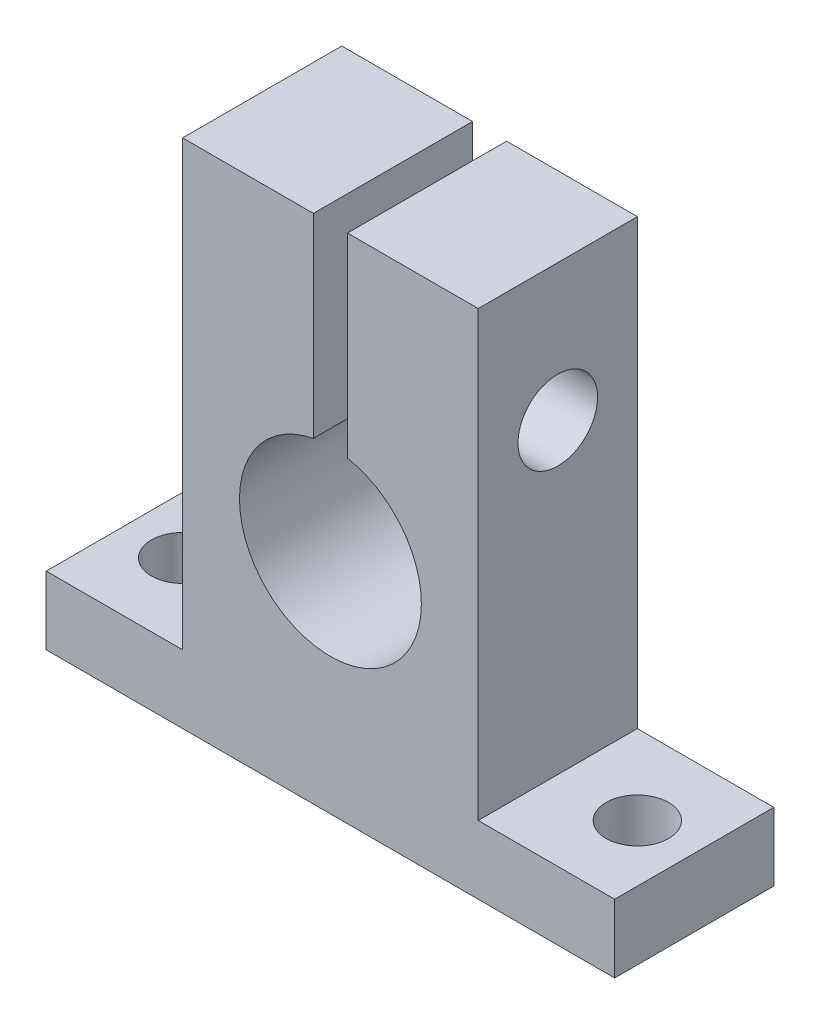
ISO-10303-21;
HEADER;
FILE_DESCRIPTION(('STEP AP214'),'2;1');
FILE_NAME('part.step','',(''),(''),'','','');
FILE_SCHEMA(('AUTOMOTIVE_DESIGN { 1 0 10303 214 1 1 1 1 }'));
ENDSEC;
DATA;
#1=APPLICATION_CONTEXT('core data for automotive mechanical design processes');
#2=APPLICATION_PROTOCOL_DEFINITION('international standard','automotive_design',2000,#1);
#3=PRODUCT_CONTEXT('',#1,'mechanical');
#4=PRODUCT('Part','Part','',(#3));
#5=PRODUCT_RELATED_PRODUCT_CATEGORY('part','',(#4));
#6=PRODUCT_DEFINITION_FORMATION('','',#4);
#7=PRODUCT_DEFINITION_CONTEXT('part definition',#1,'design');
#8=PRODUCT_DEFINITION('design','',#6,#7);
#9=PRODUCT_DEFINITION_SHAPE('','',#8);
#10=(LENGTH_UNIT() NAMED_UNIT(*) SI_UNIT(.MILLI.,.METRE.));
#11=(NAMED_UNIT(*) PLANE_ANGLE_UNIT() SI_UNIT($,.RADIAN.));
#12=(NAMED_UNIT(*) SI_UNIT($,.STERADIAN.) SOLID_ANGLE_UNIT());
#13=UNCERTAINTY_MEASURE_WITH_UNIT(LENGTH_MEASURE(1.E-05),#10,'distance_accuracy_value','');
#14=(GEOMETRIC_REPRESENTATION_CONTEXT(3) GLOBAL_UNCERTAINTY_ASSIGNED_CONTEXT((#13)) GLOBAL_UNIT_ASSIGNED_CONTEXT((#10,
#11,#12)) REPRESENTATION_CONTEXT('',''));
#15=CARTESIAN_POINT('',(0.,0.,0.));
#16=DIRECTION('',(0.,0.,1.));
#17=DIRECTION('',(1.,0.,0.));
#18=AXIS2_PLACEMENT_3D('',#15,#16,#17);
#19=CARTESIAN_POINT('',(5.82608695652173,-0.940493027310935,14.));
#20=DIRECTION('',(0.,0.,-1.));
#21=DIRECTION('',(-1.,0.,0.));
#22=AXIS2_PLACEMENT_3D('',#19,#20,#21);
#23=CYLINDRICAL_SURFACE('',#22,8.);
#24=CARTESIAN_POINT('',(5.82608695652173,-0.940493027310935,0.));
#25=DIRECTION('',(0.,0.,1.));
#26=DIRECTION('',(1.,0.,0.));
#27=AXIS2_PLACEMENT_3D('',#24,#25,#26);
#28=CIRCLE('',#27,8.);
#29=CARTESIAN_POINT('',(4.32608695652173,6.91762379543992,0.));
#30=VERTEX_POINT('',#29);
#31=CARTESIAN_POINT('',(7.32608695652173,6.91762379543992,0.));
#32=VERTEX_POINT('',#31);
#33=EDGE_CURVE('E171',#30,#32,#28,.T.);
#34=ORIENTED_EDGE('',*,*,#33,.F.);
#35=DIRECTION('',(0.,0.,-1.));
#36=VECTOR('',#35,1.);
#37=CARTESIAN_POINT('',(4.32608695652173,6.91762379543992,14.));
#38=LINE('',#37,#36);
#39=CARTESIAN_POINT('',(4.32608695652173,6.91762379543992,14.));
#40=VERTEX_POINT('',#39);
#41=EDGE_CURVE('E11',#40,#30,#38,.T.);
#42=ORIENTED_EDGE('',*,*,#41,.F.);
#43=CARTESIAN_POINT('',(5.82608695652173,-0.940493027310935,14.));
#44=DIRECTION('',(0.,0.,1.));
#45=DIRECTION('',(1.,0.,0.));
#46=AXIS2_PLACEMENT_3D('',#43,#44,#45);
#47=CIRCLE('',#46,8.);
#48=CARTESIAN_POINT('',(7.32608695652173,6.91762379543992,14.));
#49=VERTEX_POINT('',#48);
#50=EDGE_CURVE('E162',#40,#49,#47,.T.);
#51=ORIENTED_EDGE('',*,*,#50,.T.);
#52=DIRECTION('',(0.,0.,-1.));
#53=VECTOR('',#52,1.);
#54=CARTESIAN_POINT('',(7.32608695652173,6.91762379543992,14.));
#55=LINE('',#54,#53);
#56=EDGE_CURVE('E99',#49,#32,#55,.T.);
#57=ORIENTED_EDGE('',*,*,#56,.T.);
#58=EDGE_LOOP('',(#34,#42,#51,#57));
#59=FACE_BOUND('',#58,.T.);
#60=ADVANCED_FACE('F35',(#59),#23,.F.);
#61=CARTESIAN_POINT('',(4.32608695652173,0.,14.));
#62=DIRECTION('',(1.,0.,0.));
#63=DIRECTION('',(0.,1.,0.));
#64=AXIS2_PLACEMENT_3D('',#61,#62,#63);
#65=PLANE('',#64);
#66=CARTESIAN_POINT('',(4.32608695652173,12.0595069726891,7.));
#67=DIRECTION('',(1.,0.,0.));
#68=DIRECTION('',(0.,1.,0.));
#69=AXIS2_PLACEMENT_3D('',#66,#67,#68);
#70=CIRCLE('',#69,3.5);
#71=CARTESIAN_POINT('',(4.32608695652173,15.5595069726891,7.));
#72=VERTEX_POINT('',#71);
#73=EDGE_CURVE('E168',#72,#72,#70,.T.);
#74=ORIENTED_EDGE('',*,*,#73,.F.);
#75=EDGE_LOOP('',(#74));
#76=FACE_BOUND('',#75,.T.);
#77=DIRECTION('',(0.,-1.,0.));
#78=VECTOR('',#77,1.);
#79=CARTESIAN_POINT('',(4.32608695652173,0.,0.));
#80=LINE('',#79,#78);
#81=CARTESIAN_POINT('',(4.32608695652173,24.0595069726891,0.));
#82=VERTEX_POINT('',#81);
#83=EDGE_CURVE('E220',#82,#30,#80,.T.);
#84=ORIENTED_EDGE('',*,*,#83,.F.);
#85=DIRECTION('',(0.,0.,-1.));
#86=VECTOR('',#85,1.);
#87=CARTESIAN_POINT('',(4.32608695652173,24.0595069726891,14.));
#88=LINE('',#87,#86);
#89=CARTESIAN_POINT('',(4.32608695652173,24.0595069726891,14.));
#90=VERTEX_POINT('',#89);
#91=EDGE_CURVE('E44',#90,#82,#88,.T.);
#92=ORIENTED_EDGE('',*,*,#91,.F.);
#93=DIRECTION('',(0.,-1.,0.));
#94=VECTOR('',#93,1.);
#95=CARTESIAN_POINT('',(4.32608695652173,0.,14.));
#96=LINE('',#95,#94);
#97=EDGE_CURVE('E157',#90,#40,#96,.T.);
#98=ORIENTED_EDGE('',*,*,#97,.T.);
#99=ORIENTED_EDGE('',*,*,#41,.T.);
#100=EDGE_LOOP('',(#84,#92,#98,#99));
#101=FACE_BOUND('',#100,.T.);
#102=ADVANCED_FACE('F211',(#76,#101),#65,.T.);
#103=CARTESIAN_POINT('',(0.,24.0595069726891,14.));
#104=DIRECTION('',(0.,1.,0.));
#105=DIRECTION('',(0.,0.,1.));
#106=AXIS2_PLACEMENT_3D('',#103,#104,#105);
#107=PLANE('',#106);
#108=DIRECTION('',(1.,0.,0.));
#109=VECTOR('',#108,1.);
#110=CARTESIAN_POINT('',(0.,24.0595069726891,0.));
#111=LINE('',#110,#109);
#112=CARTESIAN_POINT('',(-7.17391304347828,24.0595069726891,0.));
#113=VERTEX_POINT('',#112);
#114=EDGE_CURVE('E227',#113,#82,#111,.T.);
#115=ORIENTED_EDGE('',*,*,#114,.F.);
#116=DIRECTION('',(0.,0.,-1.));
#117=VECTOR('',#116,1.);
#118=CARTESIAN_POINT('',(-7.17391304347828,24.0595069726891,14.));
#119=LINE('',#118,#117);
#120=CARTESIAN_POINT('',(-7.17391304347828,24.0595069726891,14.));
#121=VERTEX_POINT('',#120);
#122=EDGE_CURVE('E265',#121,#113,#119,.T.);
#123=ORIENTED_EDGE('',*,*,#122,.F.);
#124=DIRECTION('',(1.,0.,0.));
#125=VECTOR('',#124,1.);
#126=CARTESIAN_POINT('',(0.,24.0595069726891,14.));
#127=LINE('',#126,#125);
#128=EDGE_CURVE('E151',#121,#90,#127,.T.);
#129=ORIENTED_EDGE('',*,*,#128,.T.);
#130=ORIENTED_EDGE('',*,*,#91,.T.);
#131=EDGE_LOOP('',(#115,#123,#129,#130));
#132=FACE_BOUND('',#131,.T.);
#133=ADVANCED_FACE('F215',(#132),#107,.T.);
#134=CARTESIAN_POINT('',(-7.17391304347827,0.,14.));
#135=DIRECTION('',(1.,0.,0.));
#136=DIRECTION('',(0.,1.,0.));
#137=AXIS2_PLACEMENT_3D('',#134,#135,#136);
#138=PLANE('',#137);
#139=CARTESIAN_POINT('',(-7.17391304347828,12.0595069726891,7.));
#140=DIRECTION('',(1.,0.,0.));
#141=DIRECTION('',(0.,1.,0.));
#142=AXIS2_PLACEMENT_3D('',#139,#140,#141);
#143=CIRCLE('',#142,3.5);
#144=CARTESIAN_POINT('',(-7.17391304347828,15.5595069726891,7.));
#145=VERTEX_POINT('',#144);
#146=EDGE_CURVE('E176',#145,#145,#143,.T.);
#147=ORIENTED_EDGE('',*,*,#146,.T.);
#148=EDGE_LOOP('',(#147));
#149=FACE_BOUND('',#148,.T.);
#150=DIRECTION('',(0.,-1.,0.));
#151=VECTOR('',#150,1.);
#152=CARTESIAN_POINT('',(-7.17391304347827,0.,0.));
#153=LINE('',#152,#151);
#154=CARTESIAN_POINT('',(-7.17391304347827,-14.9404930273109,0.));
#155=VERTEX_POINT('',#154);
#156=EDGE_CURVE('E229',#113,#155,#153,.T.);
#157=ORIENTED_EDGE('',*,*,#156,.T.);
#158=DIRECTION('',(0.,0.,-1.));
#159=VECTOR('',#158,1.);
#160=CARTESIAN_POINT('',(-7.17391304347827,-14.9404930273109,14.));
#161=LINE('',#160,#159);
#162=CARTESIAN_POINT('',(-7.17391304347827,-14.9404930273109,14.));
#163=VERTEX_POINT('',#162);
#164=EDGE_CURVE('E263',#163,#155,#161,.T.);
#165=ORIENTED_EDGE('',*,*,#164,.F.);
#166=DIRECTION('',(0.,-1.,0.));
#167=VECTOR('',#166,1.);
#168=CARTESIAN_POINT('',(-7.17391304347827,0.,14.));
#169=LINE('',#168,#167);
#170=EDGE_CURVE('E156',#121,#163,#169,.T.);
#171=ORIENTED_EDGE('',*,*,#170,.F.);
#172=ORIENTED_EDGE('',*,*,#122,.T.);
#173=EDGE_LOOP('',(#157,#165,#171,#172));
#174=FACE_BOUND('',#173,.T.);
#175=ADVANCED_FACE('F305',(#149,#174),#138,.F.);
#176=CARTESIAN_POINT('',(0.,-14.9404930273109,14.));
#177=DIRECTION('',(0.,1.,0.));
#178=DIRECTION('',(0.,0.,1.));
#179=AXIS2_PLACEMENT_3D('',#176,#177,#178);
#180=PLANE('',#179);
#181=CARTESIAN_POINT('',(-14.1739130434783,-14.9404930273109,7.));
#182=DIRECTION('',(0.,1.,0.));
#183=DIRECTION('',(0.,0.,1.));
#184=AXIS2_PLACEMENT_3D('',#181,#182,#183);
#185=CIRCLE('',#184,2.75);
#186=CARTESIAN_POINT('',(-14.1739130434783,-14.9404930273109,9.75));
#187=VERTEX_POINT('',#186);
#188=EDGE_CURVE('E177',#187,#187,#185,.T.);
#189=ORIENTED_EDGE('',*,*,#188,.F.);
#190=EDGE_LOOP('',(#189));
#191=FACE_BOUND('',#190,.T.);
#192=DIRECTION('',(1.,0.,0.));
#193=VECTOR('',#192,1.);
#194=CARTESIAN_POINT('',(0.,-14.9404930273109,0.));
#195=LINE('',#194,#193);
#196=CARTESIAN_POINT('',(-19.1739130434783,-14.9404930273109,0.));
#197=VERTEX_POINT('',#196);
#198=EDGE_CURVE('E235',#197,#155,#195,.T.);
#199=ORIENTED_EDGE('',*,*,#198,.F.);
#200=DIRECTION('',(0.,0.,-1.));
#201=VECTOR('',#200,1.);
#202=CARTESIAN_POINT('',(-19.1739130434783,-14.9404930273109,14.));
#203=LINE('',#202,#201);
#204=CARTESIAN_POINT('',(-19.1739130434783,-14.9404930273109,14.));
#205=VERTEX_POINT('',#204);
#206=EDGE_CURVE('E261',#205,#197,#203,.T.);
#207=ORIENTED_EDGE('',*,*,#206,.F.);
#208=DIRECTION('',(1.,0.,0.));
#209=VECTOR('',#208,1.);
#210=CARTESIAN_POINT('',(0.,-14.9404930273109,14.));
#211=LINE('',#210,#209);
#212=EDGE_CURVE('E160',#205,#163,#211,.T.);
#213=ORIENTED_EDGE('',*,*,#212,.T.);
#214=ORIENTED_EDGE('',*,*,#164,.T.);
#215=EDGE_LOOP('',(#199,#207,#213,#214));
#216=FACE_BOUND('',#215,.T.);
#217=ADVANCED_FACE('F301',(#191,#216),#180,.T.);
#218=CARTESIAN_POINT('',(-19.1739130434783,0.,14.));
#219=DIRECTION('',(1.,0.,0.));
#220=DIRECTION('',(0.,1.,0.));
#221=AXIS2_PLACEMENT_3D('',#218,#219,#220);
#222=PLANE('',#221);
#223=DIRECTION('',(0.,-1.,0.));
#224=VECTOR('',#223,1.);
#225=CARTESIAN_POINT('',(-19.1739130434783,0.,0.));
#226=LINE('',#225,#224);
#227=CARTESIAN_POINT('',(-19.1739130434783,-20.9404930273109,0.));
#228=VERTEX_POINT('',#227);
#229=EDGE_CURVE('E238',#197,#228,#226,.T.);
#230=ORIENTED_EDGE('',*,*,#229,.T.);
#231=DIRECTION('',(0.,0.,-1.));
#232=VECTOR('',#231,1.);
#233=CARTESIAN_POINT('',(-19.1739130434783,-20.9404930273109,14.));
#234=LINE('',#233,#232);
#235=CARTESIAN_POINT('',(-19.1739130434783,-20.9404930273109,14.));
#236=VERTEX_POINT('',#235);
#237=EDGE_CURVE('E258',#236,#228,#234,.T.);
#238=ORIENTED_EDGE('',*,*,#237,.F.);
#239=DIRECTION('',(0.,-1.,0.));
#240=VECTOR('',#239,1.);
#241=CARTESIAN_POINT('',(-19.1739130434783,0.,14.));
#242=LINE('',#241,#240);
#243=EDGE_CURVE('E323',#205,#236,#242,.T.);
#244=ORIENTED_EDGE('',*,*,#243,.F.);
#245=ORIENTED_EDGE('',*,*,#206,.T.);
#246=EDGE_LOOP('',(#230,#238,#244,#245));
#247=FACE_BOUND('',#246,.T.);
#248=ADVANCED_FACE('F297',(#247),#222,.F.);
#249=CARTESIAN_POINT('',(0.,-20.9404930273109,14.));
#250=DIRECTION('',(0.,1.,0.));
#251=DIRECTION('',(-1.,0.,0.));
#252=AXIS2_PLACEMENT_3D('',#249,#250,#251);
#253=PLANE('',#252);
#254=CARTESIAN_POINT('',(-14.1739130434783,-20.9404930273109,7.));
#255=DIRECTION('',(0.,-1.,0.));
#256=DIRECTION('',(1.,0.,0.));
#257=AXIS2_PLACEMENT_3D('',#254,#255,#256);
#258=CIRCLE('',#257,2.75);
#259=CARTESIAN_POINT('',(-11.4239130434783,-20.9404930273109,7.));
#260=VERTEX_POINT('',#259);
#261=EDGE_CURVE('E185',#260,#260,#258,.T.);
#262=ORIENTED_EDGE('',*,*,#261,.F.);
#263=EDGE_LOOP('',(#262));
#264=FACE_BOUND('',#263,.T.);
#265=CARTESIAN_POINT('',(25.8260869565217,-20.9404930273109,7.));
#266=DIRECTION('',(0.,-1.,0.));
#267=DIRECTION('',(-1.,0.,0.));
#268=AXIS2_PLACEMENT_3D('',#265,#266,#267);
#269=CIRCLE('',#268,2.75);
#270=CARTESIAN_POINT('',(23.0760869565217,-20.9404930273109,7.));
#271=VERTEX_POINT('',#270);
#272=EDGE_CURVE('E182',#271,#271,#269,.T.);
#273=ORIENTED_EDGE('',*,*,#272,.F.);
#274=EDGE_LOOP('',(#273));
#275=FACE_BOUND('',#274,.T.);
#276=DIRECTION('',(1.,0.,0.));
#277=VECTOR('',#276,1.);
#278=CARTESIAN_POINT('',(0.,-20.9404930273109,0.));
#279=LINE('',#278,#277);
#280=CARTESIAN_POINT('',(30.8260869565217,-20.9404930273109,0.));
#281=VERTEX_POINT('',#280);
#282=EDGE_CURVE('E240',#228,#281,#279,.T.);
#283=ORIENTED_EDGE('',*,*,#282,.T.);
#284=DIRECTION('',(0.,0.,-1.));
#285=VECTOR('',#284,1.);
#286=CARTESIAN_POINT('',(30.8260869565217,-20.9404930273109,14.));
#287=LINE('',#286,#285);
#288=CARTESIAN_POINT('',(30.8260869565217,-20.9404930273109,14.));
#289=VERTEX_POINT('',#288);
#290=EDGE_CURVE('E256',#289,#281,#287,.T.);
#291=ORIENTED_EDGE('',*,*,#290,.F.);
#292=DIRECTION('',(1.,0.,0.));
#293=VECTOR('',#292,1.);
#294=CARTESIAN_POINT('',(0.,-20.9404930273109,14.));
#295=LINE('',#294,#293);
#296=EDGE_CURVE('E325',#236,#289,#295,.T.);
#297=ORIENTED_EDGE('',*,*,#296,.F.);
#298=ORIENTED_EDGE('',*,*,#237,.T.);
#299=EDGE_LOOP('',(#283,#291,#297,#298));
#300=FACE_BOUND('',#299,.T.);
#301=ADVANCED_FACE('F293',(#264,#275,#300),#253,.F.);
#302=CARTESIAN_POINT('',(30.8260869565217,0.,14.));
#303=DIRECTION('',(1.,0.,0.));
#304=DIRECTION('',(0.,1.,0.));
#305=AXIS2_PLACEMENT_3D('',#302,#303,#304);
#306=PLANE('',#305);
#307=DIRECTION('',(0.,-1.,0.));
#308=VECTOR('',#307,1.);
#309=CARTESIAN_POINT('',(30.8260869565217,0.,0.));
#310=LINE('',#309,#308);
#311=CARTESIAN_POINT('',(30.8260869565217,-14.9404930273109,0.));
#312=VERTEX_POINT('',#311);
#313=EDGE_CURVE('E243',#312,#281,#310,.T.);
#314=ORIENTED_EDGE('',*,*,#313,.F.);
#315=DIRECTION('',(0.,0.,-1.));
#316=VECTOR('',#315,1.);
#317=CARTESIAN_POINT('',(30.8260869565217,-14.9404930273109,14.));
#318=LINE('',#317,#316);
#319=CARTESIAN_POINT('',(30.8260869565217,-14.9404930273109,14.));
#320=VERTEX_POINT('',#319);
#321=EDGE_CURVE('E254',#320,#312,#318,.T.);
#322=ORIENTED_EDGE('',*,*,#321,.F.);
#323=DIRECTION('',(0.,-1.,0.));
#324=VECTOR('',#323,1.);
#325=CARTESIAN_POINT('',(30.8260869565217,0.,14.));
#326=LINE('',#325,#324);
#327=EDGE_CURVE('E329',#320,#289,#326,.T.);
#328=ORIENTED_EDGE('',*,*,#327,.T.);
#329=ORIENTED_EDGE('',*,*,#290,.T.);
#330=EDGE_LOOP('',(#314,#322,#328,#329));
#331=FACE_BOUND('',#330,.T.);
#332=ADVANCED_FACE('F290',(#331),#306,.T.);
#333=CARTESIAN_POINT('',(0.,-14.9404930273109,14.));
#334=DIRECTION('',(0.,-1.,0.));
#335=DIRECTION('',(0.,0.,-1.));
#336=AXIS2_PLACEMENT_3D('',#333,#334,#335);
#337=PLANE('',#336);
#338=CARTESIAN_POINT('',(25.8260869565217,-14.9404930273109,7.));
#339=DIRECTION('',(0.,-1.,0.));
#340=DIRECTION('',(0.,0.,-1.));
#341=AXIS2_PLACEMENT_3D('',#338,#339,#340);
#342=CIRCLE('',#341,2.75);
#343=CARTESIAN_POINT('',(25.8260869565217,-14.9404930273109,4.25));
#344=VERTEX_POINT('',#343);
#345=EDGE_CURVE('E38',#344,#344,#342,.T.);
#346=ORIENTED_EDGE('',*,*,#345,.T.);
#347=EDGE_LOOP('',(#346));
#348=FACE_BOUND('',#347,.T.);
#349=DIRECTION('',(-1.,0.,0.));
#350=VECTOR('',#349,1.);
#351=CARTESIAN_POINT('',(0.,-14.9404930273109,0.));
#352=LINE('',#351,#350);
#353=CARTESIAN_POINT('',(18.8260869565217,-14.9404930273109,0.));
#354=VERTEX_POINT('',#353);
#355=EDGE_CURVE('E246',#312,#354,#352,.T.);
#356=ORIENTED_EDGE('',*,*,#355,.T.);
#357=DIRECTION('',(0.,0.,-1.));
#358=VECTOR('',#357,1.);
#359=CARTESIAN_POINT('',(18.8260869565217,-14.9404930273109,14.));
#360=LINE('',#359,#358);
#361=CARTESIAN_POINT('',(18.8260869565217,-14.9404930273109,14.));
#362=VERTEX_POINT('',#361);
#363=EDGE_CURVE('E140',#362,#354,#360,.T.);
#364=ORIENTED_EDGE('',*,*,#363,.F.);
#365=DIRECTION('',(-1.,0.,0.));
#366=VECTOR('',#365,1.);
#367=CARTESIAN_POINT('',(0.,-14.9404930273109,14.));
#368=LINE('',#367,#366);
#369=EDGE_CURVE('E146',#320,#362,#368,.T.);
#370=ORIENTED_EDGE('',*,*,#369,.F.);
#371=ORIENTED_EDGE('',*,*,#321,.T.);
#372=EDGE_LOOP('',(#356,#364,#370,#371));
#373=FACE_BOUND('',#372,.T.);
#374=ADVANCED_FACE('F192',(#348,#373),#337,.F.);
#375=CARTESIAN_POINT('',(18.8260869565217,0.,14.));
#376=DIRECTION('',(1.,0.,0.));
#377=DIRECTION('',(0.,1.,0.));
#378=AXIS2_PLACEMENT_3D('',#375,#376,#377);
#379=PLANE('',#378);
#380=CARTESIAN_POINT('',(18.8260869565217,12.0595069726891,7.));
#381=DIRECTION('',(1.,0.,0.));
#382=DIRECTION('',(0.,1.,0.));
#383=AXIS2_PLACEMENT_3D('',#380,#381,#382);
#384=CIRCLE('',#383,3.5);
#385=CARTESIAN_POINT('',(18.8260869565217,15.5595069726891,7.));
#386=VERTEX_POINT('',#385);
#387=EDGE_CURVE('E173',#386,#386,#384,.T.);
#388=ORIENTED_EDGE('',*,*,#387,.F.);
#389=EDGE_LOOP('',(#388));
#390=FACE_BOUND('',#389,.T.);
#391=DIRECTION('',(0.,-1.,0.));
#392=VECTOR('',#391,1.);
#393=CARTESIAN_POINT('',(18.8260869565217,0.,0.));
#394=LINE('',#393,#392);
#395=CARTESIAN_POINT('',(18.8260869565217,24.0595069726891,0.));
#396=VERTEX_POINT('',#395);
#397=EDGE_CURVE('E135',#396,#354,#394,.T.);
#398=ORIENTED_EDGE('',*,*,#397,.F.);
#399=DIRECTION('',(0.,0.,-1.));
#400=VECTOR('',#399,1.);
#401=CARTESIAN_POINT('',(18.8260869565217,24.0595069726891,14.));
#402=LINE('',#401,#400);
#403=CARTESIAN_POINT('',(18.8260869565217,24.0595069726891,14.));
#404=VERTEX_POINT('',#403);
#405=EDGE_CURVE('E130',#404,#396,#402,.T.);
#406=ORIENTED_EDGE('',*,*,#405,.F.);
#407=DIRECTION('',(0.,-1.,0.));
#408=VECTOR('',#407,1.);
#409=CARTESIAN_POINT('',(18.8260869565217,0.,14.));
#410=LINE('',#409,#408);
#411=EDGE_CURVE('E133',#404,#362,#410,.T.);
#412=ORIENTED_EDGE('',*,*,#411,.T.);
#413=ORIENTED_EDGE('',*,*,#363,.T.);
#414=EDGE_LOOP('',(#398,#406,#412,#413));
#415=FACE_BOUND('',#414,.T.);
#416=ADVANCED_FACE('F132',(#390,#415),#379,.T.);
#417=CARTESIAN_POINT('',(7.32608695652173,24.0595069726891,0.));
#418=VERTEX_POINT('',#417);
#419=EDGE_CURVE('E231',#418,#396,#111,.T.);
#420=ORIENTED_EDGE('',*,*,#419,.F.);
#421=DIRECTION('',(0.,0.,-1.));
#422=VECTOR('',#421,1.);
#423=CARTESIAN_POINT('',(7.32608695652173,24.0595069726891,14.));
#424=LINE('',#423,#422);
#425=CARTESIAN_POINT('',(7.32608695652173,24.0595069726891,14.));
#426=VERTEX_POINT('',#425);
#427=EDGE_CURVE('E92',#426,#418,#424,.T.);
#428=ORIENTED_EDGE('',*,*,#427,.F.);
#429=EDGE_CURVE('E143',#426,#404,#127,.T.);
#430=ORIENTED_EDGE('',*,*,#429,.T.);
#431=ORIENTED_EDGE('',*,*,#405,.T.);
#432=EDGE_LOOP('',(#420,#428,#430,#431));
#433=FACE_BOUND('',#432,.T.);
#434=ADVANCED_FACE('F149',(#433),#107,.T.);
#435=CARTESIAN_POINT('',(7.32608695652173,0.,14.));
#436=DIRECTION('',(1.,0.,0.));
#437=DIRECTION('',(0.,1.,0.));
#438=AXIS2_PLACEMENT_3D('',#435,#436,#437);
#439=PLANE('',#438);
#440=CARTESIAN_POINT('',(7.32608695652173,12.0595069726891,7.));
#441=DIRECTION('',(1.,0.,0.));
#442=DIRECTION('',(0.,1.,0.));
#443=AXIS2_PLACEMENT_3D('',#440,#441,#442);
#444=CIRCLE('',#443,3.5);
#445=CARTESIAN_POINT('',(7.32608695652173,15.5595069726891,7.));
#446=VERTEX_POINT('',#445);
#447=EDGE_CURVE('E172',#446,#446,#444,.T.);
#448=ORIENTED_EDGE('',*,*,#447,.T.);
#449=EDGE_LOOP('',(#448));
#450=FACE_BOUND('',#449,.T.);
#451=DIRECTION('',(0.,-1.,0.));
#452=VECTOR('',#451,1.);
#453=CARTESIAN_POINT('',(7.32608695652173,0.,0.));
#454=LINE('',#453,#452);
#455=EDGE_CURVE('E165',#418,#32,#454,.T.);
#456=ORIENTED_EDGE('',*,*,#455,.T.);
#457=ORIENTED_EDGE('',*,*,#56,.F.);
#458=DIRECTION('',(0.,-1.,0.));
#459=VECTOR('',#458,1.);
#460=CARTESIAN_POINT('',(7.32608695652173,0.,14.));
#461=LINE('',#460,#459);
#462=EDGE_CURVE('E53',#426,#49,#461,.T.);
#463=ORIENTED_EDGE('',*,*,#462,.F.);
#464=ORIENTED_EDGE('',*,*,#427,.T.);
#465=EDGE_LOOP('',(#456,#457,#463,#464));
#466=FACE_BOUND('',#465,.T.);
#467=ADVANCED_FACE('F270',(#450,#466),#439,.F.);
#468=CARTESIAN_POINT('',(0.,0.,14.));
#469=DIRECTION('',(0.,0.,1.));
#470=DIRECTION('',(1.,0.,0.));
#471=AXIS2_PLACEMENT_3D('',#468,#469,#470);
#472=PLANE('',#471);
#473=ORIENTED_EDGE('',*,*,#50,.F.);
#474=ORIENTED_EDGE('',*,*,#97,.F.);
#475=ORIENTED_EDGE('',*,*,#128,.F.);
#476=ORIENTED_EDGE('',*,*,#170,.T.);
#477=ORIENTED_EDGE('',*,*,#212,.F.);
#478=ORIENTED_EDGE('',*,*,#243,.T.);
#479=ORIENTED_EDGE('',*,*,#296,.T.);
#480=ORIENTED_EDGE('',*,*,#327,.F.);
#481=ORIENTED_EDGE('',*,*,#369,.T.);
#482=ORIENTED_EDGE('',*,*,#411,.F.);
#483=ORIENTED_EDGE('',*,*,#429,.F.);
#484=ORIENTED_EDGE('',*,*,#462,.T.);
#485=EDGE_LOOP('',(#473,#474,#475,#476,#477,#478,#479,#480,#481,#482,#483,#484));
#486=FACE_BOUND('',#485,.T.);
#487=ADVANCED_FACE('F142',(#486),#472,.T.);
#488=CARTESIAN_POINT('',(0.,0.,0.));
#489=DIRECTION('',(0.,0.,1.));
#490=DIRECTION('',(1.,0.,0.));
#491=AXIS2_PLACEMENT_3D('',#488,#489,#490);
#492=PLANE('',#491);
#493=ORIENTED_EDGE('',*,*,#33,.T.);
#494=ORIENTED_EDGE('',*,*,#455,.F.);
#495=ORIENTED_EDGE('',*,*,#419,.T.);
#496=ORIENTED_EDGE('',*,*,#397,.T.);
#497=ORIENTED_EDGE('',*,*,#355,.F.);
#498=ORIENTED_EDGE('',*,*,#313,.T.);
#499=ORIENTED_EDGE('',*,*,#282,.F.);
#500=ORIENTED_EDGE('',*,*,#229,.F.);
#501=ORIENTED_EDGE('',*,*,#198,.T.);
#502=ORIENTED_EDGE('',*,*,#156,.F.);
#503=ORIENTED_EDGE('',*,*,#114,.T.);
#504=ORIENTED_EDGE('',*,*,#83,.T.);
#505=EDGE_LOOP('',(#493,#494,#495,#496,#497,#498,#499,#500,#501,#502,#503,#504));
#506=FACE_BOUND('',#505,.T.);
#507=ADVANCED_FACE('F224',(#506),#492,.F.);
#508=CARTESIAN_POINT('',(-7.17391304347828,12.0595069726891,7.));
#509=DIRECTION('',(1.,0.,0.));
#510=DIRECTION('',(0.,1.,0.));
#511=AXIS2_PLACEMENT_3D('',#508,#509,#510);
#512=CYLINDRICAL_SURFACE('',#511,3.5);
#513=CARTESIAN_POINT('',(18.8260869565217,15.5595069726891,7.));
#514=CARTESIAN_POINT('',(18.7062952898551,15.5595069726891,7.));
#515=CARTESIAN_POINT('',(18.5865036231884,15.5595069726891,7.));
#516=CARTESIAN_POINT('',(18.3469202898551,15.5595069726891,7.));
#517=CARTESIAN_POINT('',(18.2271286231884,15.5595069726891,7.));
#518=CARTESIAN_POINT('',(17.9875452898551,15.5595069726891,7.));
#519=CARTESIAN_POINT('',(17.8677536231884,15.5595069726891,7.));
#520=CARTESIAN_POINT('',(17.6281702898551,15.5595069726891,7.));
#521=CARTESIAN_POINT('',(17.5083786231884,15.5595069726891,7.));
#522=CARTESIAN_POINT('',(17.2687952898551,15.5595069726891,7.));
#523=CARTESIAN_POINT('',(17.1490036231884,15.5595069726891,7.));
#524=CARTESIAN_POINT('',(16.9094202898551,15.5595069726891,7.));
#525=CARTESIAN_POINT('',(16.7896286231884,15.5595069726891,7.));
#526=CARTESIAN_POINT('',(16.5500452898551,15.5595069726891,7.));
#527=CARTESIAN_POINT('',(16.4302536231884,15.5595069726891,7.));
#528=CARTESIAN_POINT('',(16.1906702898551,15.5595069726891,7.));
#529=CARTESIAN_POINT('',(16.0708786231884,15.5595069726891,7.));
#530=CARTESIAN_POINT('',(15.8312952898551,15.5595069726891,7.));
#531=CARTESIAN_POINT('',(15.7115036231884,15.5595069726891,7.));
#532=CARTESIAN_POINT('',(15.4719202898551,15.5595069726891,7.));
#533=CARTESIAN_POINT('',(15.3521286231884,15.5595069726891,7.));
#534=CARTESIAN_POINT('',(15.1125452898551,15.5595069726891,7.));
#535=CARTESIAN_POINT('',(14.9927536231884,15.5595069726891,7.));
#536=CARTESIAN_POINT('',(14.7531702898551,15.5595069726891,7.));
#537=CARTESIAN_POINT('',(14.6333786231884,15.5595069726891,7.));
#538=CARTESIAN_POINT('',(14.3937952898551,15.5595069726891,7.));
#539=CARTESIAN_POINT('',(14.2740036231884,15.5595069726891,7.));
#540=CARTESIAN_POINT('',(14.0344202898551,15.5595069726891,7.));
#541=CARTESIAN_POINT('',(13.9146286231884,15.5595069726891,7.));
#542=CARTESIAN_POINT('',(13.6750452898551,15.5595069726891,7.));
#543=CARTESIAN_POINT('',(13.5552536231884,15.5595069726891,7.));
#544=CARTESIAN_POINT('',(13.3156702898551,15.5595069726891,7.));
#545=CARTESIAN_POINT('',(13.1958786231884,15.5595069726891,7.));
#546=CARTESIAN_POINT('',(12.9562952898551,15.5595069726891,7.));
#547=CARTESIAN_POINT('',(12.8365036231884,15.5595069726891,7.));
#548=CARTESIAN_POINT('',(12.5969202898551,15.5595069726891,7.));
#549=CARTESIAN_POINT('',(12.4771286231884,15.5595069726891,7.));
#550=CARTESIAN_POINT('',(12.2375452898551,15.5595069726891,7.));
#551=CARTESIAN_POINT('',(12.1177536231884,15.5595069726891,7.));
#552=CARTESIAN_POINT('',(11.8781702898551,15.5595069726891,7.));
#553=CARTESIAN_POINT('',(11.7583786231884,15.5595069726891,7.));
#554=CARTESIAN_POINT('',(11.5187952898551,15.5595069726891,7.));
#555=CARTESIAN_POINT('',(11.3990036231884,15.5595069726891,7.));
#556=CARTESIAN_POINT('',(11.1594202898551,15.5595069726891,7.));
#557=CARTESIAN_POINT('',(11.0396286231884,15.5595069726891,7.));
#558=CARTESIAN_POINT('',(10.8000452898551,15.5595069726891,7.));
#559=CARTESIAN_POINT('',(10.6802536231884,15.5595069726891,7.));
#560=CARTESIAN_POINT('',(10.4406702898551,15.5595069726891,7.));
#561=CARTESIAN_POINT('',(10.3208786231884,15.5595069726891,7.));
#562=CARTESIAN_POINT('',(10.0812952898551,15.5595069726891,7.));
#563=CARTESIAN_POINT('',(9.9615036231884,15.5595069726891,7.));
#564=CARTESIAN_POINT('',(9.72192028985506,15.5595069726891,7.));
#565=CARTESIAN_POINT('',(9.6021286231884,15.5595069726891,7.));
#566=CARTESIAN_POINT('',(9.36254528985506,15.5595069726891,7.));
#567=CARTESIAN_POINT('',(9.24275362318839,15.5595069726891,7.));
#568=CARTESIAN_POINT('',(9.00317028985506,15.5595069726891,7.));
#569=CARTESIAN_POINT('',(8.88337862318839,15.5595069726891,7.));
#570=CARTESIAN_POINT('',(8.64379528985506,15.5595069726891,7.));
#571=CARTESIAN_POINT('',(8.52400362318839,15.5595069726891,7.));
#572=CARTESIAN_POINT('',(8.28442028985506,15.5595069726891,7.));
#573=CARTESIAN_POINT('',(8.1646286231884,15.5595069726891,7.));
#574=CARTESIAN_POINT('',(7.92504528985506,15.5595069726891,7.));
#575=CARTESIAN_POINT('',(7.80525362318839,15.5595069726891,7.));
#576=CARTESIAN_POINT('',(7.56567028985506,15.5595069726891,7.));
#577=CARTESIAN_POINT('',(7.44587862318839,15.5595069726891,7.));
#578=CARTESIAN_POINT('',(7.32608695652173,15.5595069726891,7.));
#579=B_SPLINE_CURVE_WITH_KNOTS('',3,(#513,#514,#515,#516,#517,#518,#519,#520,#521,#522,#523,
#524,#525,#526,#527,#528,#529,#530,#531,#532,#533,#534,#535,#536,#537,#538,#539,#540,#541,#542,
#543,#544,#545,#546,#547,#548,#549,#550,#551,#552,#553,#554,#555,#556,#557,#558,#559,#560,#561,
#562,#563,#564,#565,#566,#567,#568,#569,#570,#571,#572,#573,#574,#575,#576,#577,#578),
.UNSPECIFIED.,.F.,.F.,(4,2,2,2,2,2,2,2,2,2,2,2,2,2,2,2,2,2,2,2,2,2,2,2,2,2,2,2,2,2,2,2,4),(0.,
0.359374999999999,0.718750000000001,1.078125,1.4375,1.796875,2.15625,2.515625,2.875,3.234375,
3.59375,3.953125,4.3125,4.671875,5.03125,5.390625,5.75000000000001,6.109375,6.46875,6.828125,
7.18750000000001,7.54687500000001,7.90625,8.26562500000001,8.625,8.984375,9.34375000000001,
9.70312500000001,10.0625,10.421875,10.78125,11.140625,11.5),.UNSPECIFIED.);
#580=EDGE_CURVE('BSEAM207',#386,#446,#579,.T.);
#581=ORIENTED_EDGE('',*,*,#387,.T.);
#582=ORIENTED_EDGE('',*,*,#447,.F.);
#583=ORIENTED_EDGE('',*,*,#580,.T.);
#584=ORIENTED_EDGE('',*,*,#580,.F.);
#585=EDGE_LOOP('',(#581,#583,#582,#584));
#586=FACE_BOUND('',#585,.T.);
#587=ADVANCED_FACE('F207',(#586),#512,.F.);
#588=CARTESIAN_POINT('',(4.32608695652173,15.5595069726891,7.));
#589=CARTESIAN_POINT('',(4.20629528985506,15.5595069726891,7.));
#590=CARTESIAN_POINT('',(4.08650362318839,15.5595069726891,7.));
#591=CARTESIAN_POINT('',(3.84692028985506,15.5595069726891,7.));
#592=CARTESIAN_POINT('',(3.72712862318839,15.5595069726891,7.));
#593=CARTESIAN_POINT('',(3.48754528985506,15.5595069726891,7.));
#594=CARTESIAN_POINT('',(3.36775362318839,15.5595069726891,7.));
#595=CARTESIAN_POINT('',(3.12817028985506,15.5595069726891,7.));
#596=CARTESIAN_POINT('',(3.00837862318839,15.5595069726891,7.));
#597=CARTESIAN_POINT('',(2.76879528985506,15.5595069726891,7.));
#598=CARTESIAN_POINT('',(2.64900362318839,15.5595069726891,7.));
#599=CARTESIAN_POINT('',(2.40942028985506,15.5595069726891,7.));
#600=CARTESIAN_POINT('',(2.28962862318839,15.5595069726891,7.));
#601=CARTESIAN_POINT('',(2.05004528985506,15.5595069726891,7.));
#602=CARTESIAN_POINT('',(1.93025362318839,15.5595069726891,7.));
#603=CARTESIAN_POINT('',(1.69067028985506,15.5595069726891,7.));
#604=CARTESIAN_POINT('',(1.57087862318839,15.5595069726891,7.));
#605=CARTESIAN_POINT('',(1.33129528985506,15.5595069726891,7.));
#606=CARTESIAN_POINT('',(1.21150362318839,15.5595069726891,7.));
#607=CARTESIAN_POINT('',(0.971920289855058,15.5595069726891,7.));
#608=CARTESIAN_POINT('',(0.852128623188391,15.5595069726891,7.));
#609=CARTESIAN_POINT('',(0.612545289855058,15.5595069726891,7.));
#610=CARTESIAN_POINT('',(0.492753623188392,15.5595069726891,7.));
#611=CARTESIAN_POINT('',(0.253170289855059,15.5595069726891,7.));
#612=CARTESIAN_POINT('',(0.133378623188392,15.5595069726891,7.));
#613=CARTESIAN_POINT('',(-0.106204710144942,15.5595069726891,7.));
#614=CARTESIAN_POINT('',(-0.225996376811609,15.5595069726891,7.));
#615=CARTESIAN_POINT('',(-0.465579710144942,15.5595069726891,7.));
#616=CARTESIAN_POINT('',(-0.585371376811609,15.5595069726891,7.));
#617=CARTESIAN_POINT('',(-0.824954710144942,15.5595069726891,7.));
#618=CARTESIAN_POINT('',(-0.944746376811609,15.5595069726891,7.));
#619=CARTESIAN_POINT('',(-1.18432971014494,15.5595069726891,7.));
#620=CARTESIAN_POINT('',(-1.30412137681161,15.5595069726891,7.));
#621=CARTESIAN_POINT('',(-1.54370471014494,15.5595069726891,7.));
#622=CARTESIAN_POINT('',(-1.66349637681161,15.5595069726891,7.));
#623=CARTESIAN_POINT('',(-1.90307971014494,15.5595069726891,7.));
#624=CARTESIAN_POINT('',(-2.02287137681161,15.5595069726891,7.));
#625=CARTESIAN_POINT('',(-2.26245471014494,15.5595069726891,7.));
#626=CARTESIAN_POINT('',(-2.38224637681161,15.5595069726891,7.));
#627=CARTESIAN_POINT('',(-2.62182971014494,15.5595069726891,7.));
#628=CARTESIAN_POINT('',(-2.74162137681161,15.5595069726891,7.));
#629=CARTESIAN_POINT('',(-2.98120471014494,15.5595069726891,7.));
#630=CARTESIAN_POINT('',(-3.10099637681161,15.5595069726891,7.));
#631=CARTESIAN_POINT('',(-3.34057971014494,15.5595069726891,7.));
#632=CARTESIAN_POINT('',(-3.46037137681161,15.5595069726891,7.));
#633=CARTESIAN_POINT('',(-3.69995471014494,15.5595069726891,7.));
#634=CARTESIAN_POINT('',(-3.81974637681161,15.5595069726891,7.));
#635=CARTESIAN_POINT('',(-4.05932971014494,15.5595069726891,7.));
#636=CARTESIAN_POINT('',(-4.17912137681161,15.5595069726891,7.));
#637=CARTESIAN_POINT('',(-4.41870471014494,15.5595069726891,7.));
#638=CARTESIAN_POINT('',(-4.53849637681161,15.5595069726891,7.));
#639=CARTESIAN_POINT('',(-4.77807971014494,15.5595069726891,7.));
#640=CARTESIAN_POINT('',(-4.89787137681161,15.5595069726891,7.));
#641=CARTESIAN_POINT('',(-5.13745471014495,15.5595069726891,7.));
#642=CARTESIAN_POINT('',(-5.25724637681161,15.5595069726891,7.));
#643=CARTESIAN_POINT('',(-5.49682971014495,15.5595069726891,7.));
#644=CARTESIAN_POINT('',(-5.61662137681161,15.5595069726891,7.));
#645=CARTESIAN_POINT('',(-5.85620471014495,15.5595069726891,7.));
#646=CARTESIAN_POINT('',(-5.97599637681161,15.5595069726891,7.));
#647=CARTESIAN_POINT('',(-6.21557971014495,15.5595069726891,7.));
#648=CARTESIAN_POINT('',(-6.33537137681161,15.5595069726891,7.));
#649=CARTESIAN_POINT('',(-6.57495471014495,15.5595069726891,7.));
#650=CARTESIAN_POINT('',(-6.69474637681161,15.5595069726891,7.));
#651=CARTESIAN_POINT('',(-6.93432971014495,15.5595069726891,7.));
#652=CARTESIAN_POINT('',(-7.05412137681161,15.5595069726891,7.));
#653=CARTESIAN_POINT('',(-7.17391304347828,15.5595069726891,7.));
#654=B_SPLINE_CURVE_WITH_KNOTS('',3,(#588,#589,#590,#591,#592,#593,#594,#595,#596,#597,#598,
#599,#600,#601,#602,#603,#604,#605,#606,#607,#608,#609,#610,#611,#612,#613,#614,#615,#616,#617,
#618,#619,#620,#621,#622,#623,#624,#625,#626,#627,#628,#629,#630,#631,#632,#633,#634,#635,#636,
#637,#638,#639,#640,#641,#642,#643,#644,#645,#646,#647,#648,#649,#650,#651,#652,#653),
.UNSPECIFIED.,.F.,.F.,(4,2,2,2,2,2,2,2,2,2,2,2,2,2,2,2,2,2,2,2,2,2,2,2,2,2,2,2,2,2,2,2,4),(0.,
0.359375,0.718750000000001,1.078125,1.4375,1.796875,2.15625,2.515625,2.875,3.234375,3.59375,
3.953125,4.3125,4.671875,5.03125,5.390625,5.75,6.109375,6.46875,6.82812500000001,
7.18750000000001,7.54687500000001,7.90625000000001,8.26562500000001,8.62500000000001,
8.98437500000001,9.34375000000001,9.70312500000001,10.0625,10.421875,10.78125,11.140625,11.5),.UNSPECIFIED.);
#655=EDGE_CURVE('BSEAM198',#72,#145,#654,.T.);
#656=ORIENTED_EDGE('',*,*,#73,.T.);
#657=ORIENTED_EDGE('',*,*,#146,.F.);
#658=ORIENTED_EDGE('',*,*,#655,.T.);
#659=ORIENTED_EDGE('',*,*,#655,.F.);
#660=EDGE_LOOP('',(#656,#658,#657,#659));
#661=FACE_BOUND('',#660,.T.);
#662=ADVANCED_FACE('F198',(#661),#512,.F.);
#663=CARTESIAN_POINT('',(25.8260869565217,-6.94049302731094,7.));
#664=DIRECTION('',(0.,-1.,0.));
#665=DIRECTION('',(1.,0.,0.));
#666=AXIS2_PLACEMENT_3D('',#663,#664,#665);
#667=CYLINDRICAL_SURFACE('',#666,2.75);
#668=ORIENTED_EDGE('',*,*,#272,.T.);
#669=EDGE_LOOP('',(#668));
#670=FACE_BOUND('',#669,.T.);
#671=ORIENTED_EDGE('',*,*,#345,.F.);
#672=EDGE_LOOP('',(#671));
#673=FACE_BOUND('',#672,.T.);
#674=ADVANCED_FACE('F195',(#670,#673),#667,.F.);
#675=CARTESIAN_POINT('',(-14.1739130434783,-6.94049302731094,7.));
#676=DIRECTION('',(0.,-1.,0.));
#677=DIRECTION('',(1.,0.,0.));
#678=AXIS2_PLACEMENT_3D('',#675,#676,#677);
#679=CYLINDRICAL_SURFACE('',#678,2.75);
#680=ORIENTED_EDGE('',*,*,#188,.T.);
#681=EDGE_LOOP('',(#680));
#682=FACE_BOUND('',#681,.T.);
#683=ORIENTED_EDGE('',*,*,#261,.T.);
#684=EDGE_LOOP('',(#683));
#685=FACE_BOUND('',#684,.T.);
#686=ADVANCED_FACE('F197',(#682,#685),#679,.F.);
#687=CLOSED_SHELL('',(#60,#102,#133,#175,#217,#248,#301,#332,#374,#416,#434,#467,#487,#507,#587,
#662,#674,#686));
#688=MANIFOLD_SOLID_BREP('B2',#687);
#689=ADVANCED_BREP_SHAPE_REPRESENTATION('',(#18,#688),#14);
#690=SHAPE_DEFINITION_REPRESENTATION(#9,#689);
ENDSEC;
END-ISO-10303-21;
